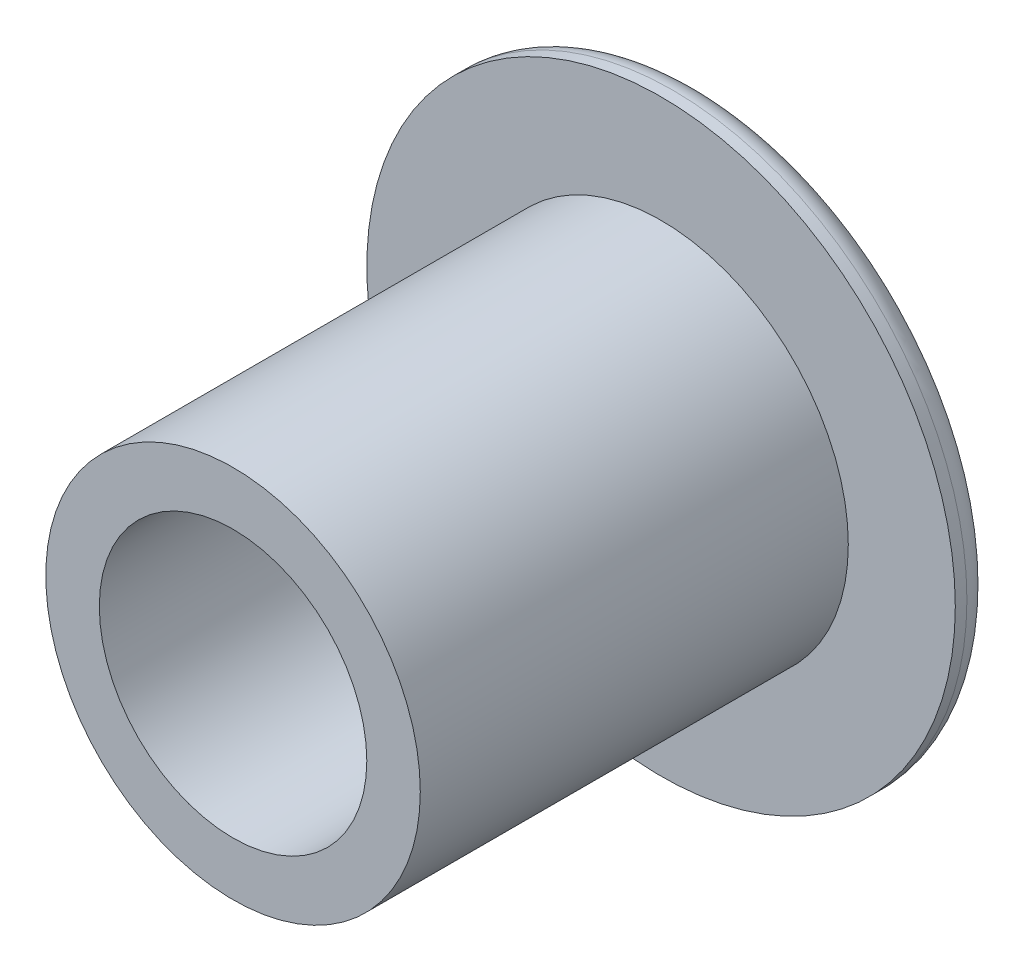
ISO-10303-21;
HEADER;
FILE_DESCRIPTION(('STEP AP214'),'2;1');
FILE_NAME('part.step','',(''),(''),'','','');
FILE_SCHEMA(('AUTOMOTIVE_DESIGN { 1 0 10303 214 1 1 1 1 }'));
ENDSEC;
DATA;
#1=APPLICATION_CONTEXT('core data for automotive mechanical design processes');
#2=APPLICATION_PROTOCOL_DEFINITION('international standard','automotive_design',2000,#1);
#3=PRODUCT_CONTEXT('',#1,'mechanical');
#4=PRODUCT('Part','Part','',(#3));
#5=PRODUCT_RELATED_PRODUCT_CATEGORY('part','',(#4));
#6=PRODUCT_DEFINITION_FORMATION('','',#4);
#7=PRODUCT_DEFINITION_CONTEXT('part definition',#1,'design');
#8=PRODUCT_DEFINITION('design','',#6,#7);
#9=PRODUCT_DEFINITION_SHAPE('','',#8);
#10=(LENGTH_UNIT() NAMED_UNIT(*) SI_UNIT(.MILLI.,.METRE.));
#11=(NAMED_UNIT(*) PLANE_ANGLE_UNIT() SI_UNIT($,.RADIAN.));
#12=(NAMED_UNIT(*) SI_UNIT($,.STERADIAN.) SOLID_ANGLE_UNIT());
#13=UNCERTAINTY_MEASURE_WITH_UNIT(LENGTH_MEASURE(1.E-05),#10,'distance_accuracy_value','');
#14=(GEOMETRIC_REPRESENTATION_CONTEXT(3) GLOBAL_UNCERTAINTY_ASSIGNED_CONTEXT((#13)) GLOBAL_UNIT_ASSIGNED_CONTEXT((#10,
#11,#12)) REPRESENTATION_CONTEXT('',''));
#15=CARTESIAN_POINT('',(0.,0.,0.));
#16=DIRECTION('',(0.,0.,1.));
#17=DIRECTION('',(1.,0.,0.));
#18=AXIS2_PLACEMENT_3D('',#15,#16,#17);
#19=CARTESIAN_POINT('',(0.,0.,-7.78154209398925));
#20=DIRECTION('',(0.,0.,-1.));
#21=DIRECTION('',(-1.,0.,0.));
#22=AXIS2_PLACEMENT_3D('',#19,#20,#21);
#23=PLANE('',#22);
#24=CARTESIAN_POINT('',(0.,0.,-7.78154209398925));
#25=DIRECTION('',(0.,0.,-1.));
#26=DIRECTION('',(-1.,0.,0.));
#27=AXIS2_PLACEMENT_3D('',#24,#25,#26);
#28=CIRCLE('',#27,2.5);
#29=CARTESIAN_POINT('',(-2.5,0.,-7.78154209398925));
#30=VERTEX_POINT('',#29);
#31=EDGE_CURVE('E11',#30,#30,#28,.T.);
#32=ORIENTED_EDGE('',*,*,#31,.F.);
#33=EDGE_LOOP('',(#32));
#34=FACE_BOUND('',#33,.T.);
#35=ADVANCED_FACE('F41',(#34),#23,.F.);
#36=CARTESIAN_POINT('',(0.,0.,-7.78154209398925));
#37=DIRECTION('',(0.,0.,-1.));
#38=DIRECTION('',(1.,0.,0.));
#39=AXIS2_PLACEMENT_3D('',#36,#37,#38);
#40=SPHERICAL_SURFACE('',#39,2.5);
#41=ORIENTED_EDGE('',*,*,#31,.T.);
#42=EDGE_LOOP('',(#41));
#43=FACE_BOUND('',#42,.T.);
#44=ADVANCED_FACE('F48',(#43),#40,.T.);
#45=CLOSED_SHELL('',(#35,#44));
#46=MANIFOLD_SOLID_BREP('B2',#45);
#47=CARTESIAN_POINT('',(0.,0.,0.));
#48=DIRECTION('',(0.,0.,1.));
#49=DIRECTION('',(1.,0.,0.));
#50=AXIS2_PLACEMENT_3D('',#47,#48,#49);
#51=CYLINDRICAL_SURFACE('',#50,3.5);
#52=CARTESIAN_POINT('',(0.,0.,-8.));
#53=DIRECTION('',(0.,0.,1.));
#54=DIRECTION('',(1.,0.,0.));
#55=AXIS2_PLACEMENT_3D('',#52,#53,#54);
#56=CIRCLE('',#55,3.5);
#57=CARTESIAN_POINT('',(3.5,0.,-8.));
#58=VERTEX_POINT('',#57);
#59=EDGE_CURVE('E101',#58,#58,#56,.T.);
#60=ORIENTED_EDGE('',*,*,#59,.T.);
#61=EDGE_LOOP('',(#60));
#62=FACE_BOUND('',#61,.T.);
#63=CARTESIAN_POINT('',(0.,0.,0.));
#64=DIRECTION('',(0.,0.,1.));
#65=DIRECTION('',(1.,0.,0.));
#66=AXIS2_PLACEMENT_3D('',#63,#64,#65);
#67=CIRCLE('',#66,3.5);
#68=CARTESIAN_POINT('',(3.5,0.,0.));
#69=VERTEX_POINT('',#68);
#70=EDGE_CURVE('E89',#69,#69,#67,.T.);
#71=ORIENTED_EDGE('',*,*,#70,.F.);
#72=EDGE_LOOP('',(#71));
#73=FACE_BOUND('',#72,.T.);
#74=ADVANCED_FACE('F69',(#62,#73),#51,.T.);
#75=CARTESIAN_POINT('',(2.5,0.,0.));
#76=DIRECTION('',(0.,0.,1.));
#77=DIRECTION('',(1.,0.,0.));
#78=AXIS2_PLACEMENT_3D('',#75,#76,#77);
#79=PLANE('',#78);
#80=ORIENTED_EDGE('',*,*,#70,.T.);
#81=EDGE_LOOP('',(#80));
#82=FACE_BOUND('',#81,.T.);
#83=CARTESIAN_POINT('',(0.,0.,0.));
#84=DIRECTION('',(0.,0.,1.));
#85=DIRECTION('',(1.,0.,0.));
#86=AXIS2_PLACEMENT_3D('',#83,#84,#85);
#87=CIRCLE('',#86,2.5);
#88=CARTESIAN_POINT('',(2.5,0.,0.));
#89=VERTEX_POINT('',#88);
#90=EDGE_CURVE('E92',#89,#89,#87,.T.);
#91=ORIENTED_EDGE('',*,*,#90,.F.);
#92=EDGE_LOOP('',(#91));
#93=FACE_BOUND('',#92,.T.);
#94=ADVANCED_FACE('F121',(#82,#93),#79,.T.);
#95=CARTESIAN_POINT('',(0.,0.,0.));
#96=DIRECTION('',(0.,0.,1.));
#97=DIRECTION('',(1.,0.,0.));
#98=AXIS2_PLACEMENT_3D('',#95,#96,#97);
#99=CYLINDRICAL_SURFACE('',#98,2.5);
#100=ORIENTED_EDGE('',*,*,#90,.T.);
#101=EDGE_LOOP('',(#100));
#102=FACE_BOUND('',#101,.T.);
#103=CARTESIAN_POINT('',(0.,0.,-10.));
#104=DIRECTION('',(0.,0.,1.));
#105=DIRECTION('',(1.,0.,0.));
#106=AXIS2_PLACEMENT_3D('',#103,#104,#105);
#107=CIRCLE('',#106,2.5);
#108=CARTESIAN_POINT('',(2.5,0.,-10.));
#109=VERTEX_POINT('',#108);
#110=EDGE_CURVE('E95',#109,#109,#107,.T.);
#111=ORIENTED_EDGE('',*,*,#110,.F.);
#112=EDGE_LOOP('',(#111));
#113=FACE_BOUND('',#112,.T.);
#114=ADVANCED_FACE('F126',(#102,#113),#99,.F.);
#115=CARTESIAN_POINT('',(3.,0.,-10.));
#116=DIRECTION('',(0.,0.,-1.));
#117=DIRECTION('',(-1.,0.,0.));
#118=AXIS2_PLACEMENT_3D('',#115,#116,#117);
#119=PLANE('',#118);
#120=CARTESIAN_POINT('',(0.,0.,-10.));
#121=DIRECTION('',(0.,0.,-1.));
#122=DIRECTION('',(-1.,0.,0.));
#123=AXIS2_PLACEMENT_3D('',#120,#121,#122);
#124=CIRCLE('',#123,2.86150801752578);
#125=CARTESIAN_POINT('',(-2.86150801752578,0.,-10.));
#126=VERTEX_POINT('',#125);
#127=EDGE_CURVE('E76',#126,#126,#124,.T.);
#128=ORIENTED_EDGE('',*,*,#127,.T.);
#129=EDGE_LOOP('',(#128));
#130=FACE_BOUND('',#129,.T.);
#131=ORIENTED_EDGE('',*,*,#110,.T.);
#132=EDGE_LOOP('',(#131));
#133=FACE_BOUND('',#132,.T.);
#134=ADVANCED_FACE('F132',(#130,#133),#119,.T.);
#135=CARTESIAN_POINT('',(0.,0.,-8.5));
#136=DIRECTION('',(0.,0.,1.));
#137=DIRECTION('',(1.,0.,0.));
#138=AXIS2_PLACEMENT_3D('',#135,#136,#137);
#139=CONICAL_SURFACE('',#138,5.5,1.03037682652431);
#140=CARTESIAN_POINT('',(0.,0.,-9.92874646285627));
#141=DIRECTION('',(0.,0.,-1.));
#142=DIRECTION('',(-1.,0.,0.));
#143=AXIS2_PLACEMENT_3D('',#140,#141,#142);
#144=CIRCLE('',#143,3.11875589523955);
#145=CARTESIAN_POINT('',(-3.11875589523955,0.,-9.92874646285627));
#146=VERTEX_POINT('',#145);
#147=EDGE_CURVE('E80',#146,#146,#144,.F.);
#148=ORIENTED_EDGE('',*,*,#147,.T.);
#149=EDGE_LOOP('',(#148));
#150=FACE_BOUND('',#149,.T.);
#151=CARTESIAN_POINT('',(0.,0.,-8.64565127337174));
#152=DIRECTION('',(0.,0.,-1.));
#153=DIRECTION('',(-1.,0.,0.));
#154=AXIS2_PLACEMENT_3D('',#151,#152,#153);
#155=CIRCLE('',#154,5.25724787771376);
#156=CARTESIAN_POINT('',(-5.25724787771376,0.,-8.64565127337174));
#157=VERTEX_POINT('',#156);
#158=EDGE_CURVE('E84',#157,#157,#155,.T.);
#159=ORIENTED_EDGE('',*,*,#158,.T.);
#160=EDGE_LOOP('',(#159));
#161=FACE_BOUND('',#160,.T.);
#162=ADVANCED_FACE('F118',(#150,#161),#139,.T.);
#163=CARTESIAN_POINT('',(0.,0.,0.));
#164=DIRECTION('',(0.,0.,1.));
#165=DIRECTION('',(1.,0.,0.));
#166=AXIS2_PLACEMENT_3D('',#163,#164,#165);
#167=CYLINDRICAL_SURFACE('',#166,5.5);
#168=CARTESIAN_POINT('',(0.,0.,-8.21690481051547));
#169=DIRECTION('',(0.,0.,-1.));
#170=DIRECTION('',(-1.,0.,0.));
#171=AXIS2_PLACEMENT_3D('',#168,#169,#170);
#172=CIRCLE('',#171,5.5);
#173=CARTESIAN_POINT('',(-5.5,0.,-8.21690481051547));
#174=VERTEX_POINT('',#173);
#175=EDGE_CURVE('E40',#174,#174,#172,.F.);
#176=ORIENTED_EDGE('',*,*,#175,.T.);
#177=EDGE_LOOP('',(#176));
#178=FACE_BOUND('',#177,.T.);
#179=CARTESIAN_POINT('',(0.,0.,-8.));
#180=DIRECTION('',(0.,0.,1.));
#181=DIRECTION('',(1.,0.,0.));
#182=AXIS2_PLACEMENT_3D('',#179,#180,#181);
#183=CIRCLE('',#182,5.5);
#184=CARTESIAN_POINT('',(5.5,0.,-8.));
#185=VERTEX_POINT('',#184);
#186=EDGE_CURVE('E98',#185,#185,#183,.T.);
#187=ORIENTED_EDGE('',*,*,#186,.F.);
#188=EDGE_LOOP('',(#187));
#189=FACE_BOUND('',#188,.T.);
#190=ADVANCED_FACE('F110',(#178,#189),#167,.T.);
#191=CARTESIAN_POINT('',(3.5,0.,-8.));
#192=DIRECTION('',(0.,0.,1.));
#193=DIRECTION('',(1.,0.,0.));
#194=AXIS2_PLACEMENT_3D('',#191,#192,#193);
#195=PLANE('',#194);
#196=ORIENTED_EDGE('',*,*,#186,.T.);
#197=EDGE_LOOP('',(#196));
#198=FACE_BOUND('',#197,.T.);
#199=ORIENTED_EDGE('',*,*,#59,.F.);
#200=EDGE_LOOP('',(#199));
#201=FACE_BOUND('',#200,.T.);
#202=ADVANCED_FACE('F107',(#198,#201),#195,.T.);
#203=CARTESIAN_POINT('',(0.,0.,-9.5));
#204=DIRECTION('',(0.,0.,-1.));
#205=DIRECTION('',(-1.,0.,0.));
#206=AXIS2_PLACEMENT_3D('',#203,#204,#205);
#207=TOROIDAL_SURFACE('',#206,2.86150801752578,0.5);
#208=ORIENTED_EDGE('',*,*,#127,.F.);
#209=EDGE_LOOP('',(#208));
#210=FACE_BOUND('',#209,.T.);
#211=ORIENTED_EDGE('',*,*,#147,.F.);
#212=EDGE_LOOP('',(#211));
#213=FACE_BOUND('',#212,.T.);
#214=ADVANCED_FACE('F109',(#210,#213),#207,.T.);
#215=CARTESIAN_POINT('',(0.,0.,-8.21690481051547));
#216=DIRECTION('',(0.,0.,-1.));
#217=DIRECTION('',(-1.,0.,0.));
#218=AXIS2_PLACEMENT_3D('',#215,#216,#217);
#219=TOROIDAL_SURFACE('',#218,5.,0.5);
#220=ORIENTED_EDGE('',*,*,#158,.F.);
#221=EDGE_LOOP('',(#220));
#222=FACE_BOUND('',#221,.T.);
#223=ORIENTED_EDGE('',*,*,#175,.F.);
#224=EDGE_LOOP('',(#223));
#225=FACE_BOUND('',#224,.T.);
#226=ADVANCED_FACE('F71',(#222,#225),#219,.T.);
#227=CLOSED_SHELL('',(#74,#94,#114,#134,#162,#190,#202,#214,#226));
#228=MANIFOLD_SOLID_BREP('B6',#227);
#229=ADVANCED_BREP_SHAPE_REPRESENTATION('',(#18,#46,#228),#14);
#230=SHAPE_DEFINITION_REPRESENTATION(#9,#229);
ENDSEC;
END-ISO-10303-21;
